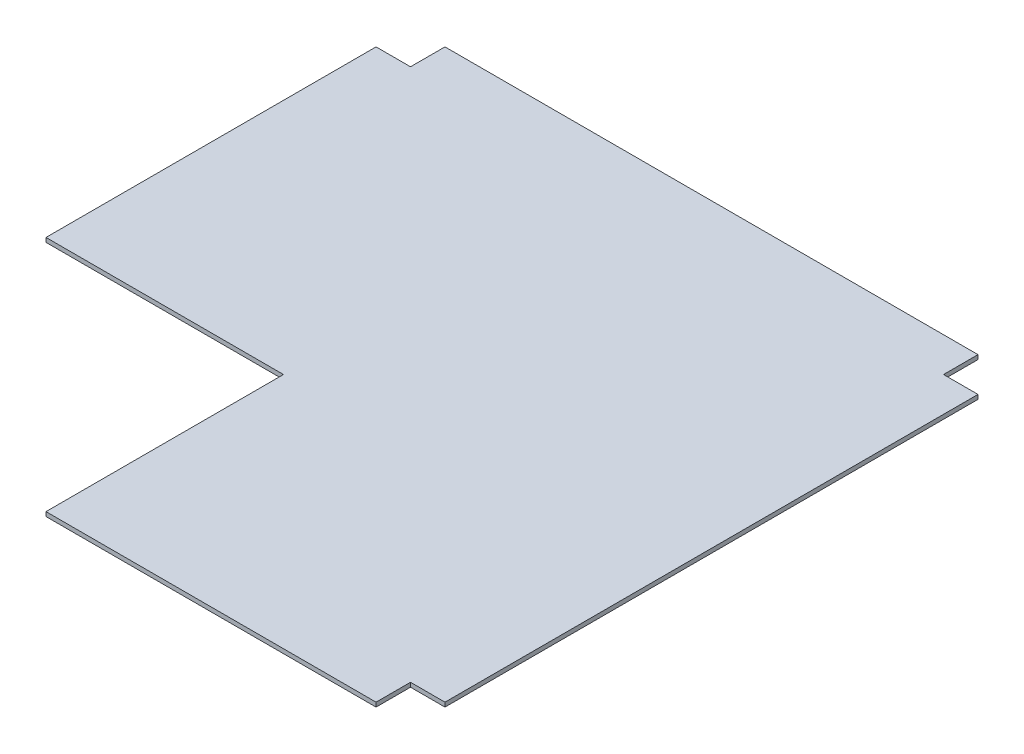
ISO-10303-21;
HEADER;
FILE_DESCRIPTION(('STEP AP214'),'2;1');
FILE_NAME('part.step','',(''),(''),'','','');
FILE_SCHEMA(('AUTOMOTIVE_DESIGN { 1 0 10303 214 1 1 1 1 }'));
ENDSEC;
DATA;
#1=APPLICATION_CONTEXT('core data for automotive mechanical design processes');
#2=APPLICATION_PROTOCOL_DEFINITION('international standard','automotive_design',2000,#1);
#3=PRODUCT_CONTEXT('',#1,'mechanical');
#4=PRODUCT('Part','Part','',(#3));
#5=PRODUCT_RELATED_PRODUCT_CATEGORY('part','',(#4));
#6=PRODUCT_DEFINITION_FORMATION('','',#4);
#7=PRODUCT_DEFINITION_CONTEXT('part definition',#1,'design');
#8=PRODUCT_DEFINITION('design','',#6,#7);
#9=PRODUCT_DEFINITION_SHAPE('','',#8);
#10=(LENGTH_UNIT() NAMED_UNIT(*) SI_UNIT(.MILLI.,.METRE.));
#11=(NAMED_UNIT(*) PLANE_ANGLE_UNIT() SI_UNIT($,.RADIAN.));
#12=(NAMED_UNIT(*) SI_UNIT($,.STERADIAN.) SOLID_ANGLE_UNIT());
#13=UNCERTAINTY_MEASURE_WITH_UNIT(LENGTH_MEASURE(1.E-05),#10,'distance_accuracy_value','');
#14=(GEOMETRIC_REPRESENTATION_CONTEXT(3) GLOBAL_UNCERTAINTY_ASSIGNED_CONTEXT((#13)) GLOBAL_UNIT_ASSIGNED_CONTEXT((#10,
#11,#12)) REPRESENTATION_CONTEXT('',''));
#15=CARTESIAN_POINT('',(0.,0.,0.));
#16=DIRECTION('',(0.,0.,1.));
#17=DIRECTION('',(1.,0.,0.));
#18=AXIS2_PLACEMENT_3D('',#15,#16,#17);
#19=CARTESIAN_POINT('',(175.,3.175,0.));
#20=DIRECTION('',(-1.,0.,0.));
#21=DIRECTION('',(0.,0.,1.));
#22=AXIS2_PLACEMENT_3D('',#19,#20,#21);
#23=PLANE('',#22);
#24=DIRECTION('',(0.,0.,-1.));
#25=VECTOR('',#24,1.);
#26=CARTESIAN_POINT('',(175.,0.,0.));
#27=LINE('',#26,#25);
#28=CARTESIAN_POINT('',(175.,0.,0.));
#29=VERTEX_POINT('',#28);
#30=CARTESIAN_POINT('',(175.,0.,-175.));
#31=VERTEX_POINT('',#30);
#32=EDGE_CURVE('E168',#29,#31,#27,.T.);
#33=ORIENTED_EDGE('',*,*,#32,.F.);
#34=DIRECTION('',(0.,-1.,0.));
#35=VECTOR('',#34,1.);
#36=CARTESIAN_POINT('',(175.,3.175,0.));
#37=LINE('',#36,#35);
#38=CARTESIAN_POINT('',(175.,3.175,0.));
#39=VERTEX_POINT('',#38);
#40=EDGE_CURVE('E11',#39,#29,#37,.T.);
#41=ORIENTED_EDGE('',*,*,#40,.F.);
#42=DIRECTION('',(0.,0.,-1.));
#43=VECTOR('',#42,1.);
#44=CARTESIAN_POINT('',(175.,3.175,0.));
#45=LINE('',#44,#43);
#46=CARTESIAN_POINT('',(175.,3.175,-175.));
#47=VERTEX_POINT('',#46);
#48=EDGE_CURVE('E210',#39,#47,#45,.T.);
#49=ORIENTED_EDGE('',*,*,#48,.T.);
#50=DIRECTION('',(0.,-1.,0.));
#51=VECTOR('',#50,1.);
#52=CARTESIAN_POINT('',(175.,3.175,-175.));
#53=LINE('',#52,#51);
#54=EDGE_CURVE('E108',#47,#31,#53,.T.);
#55=ORIENTED_EDGE('',*,*,#54,.T.);
#56=EDGE_LOOP('',(#33,#41,#49,#55));
#57=FACE_BOUND('',#56,.T.);
#58=ADVANCED_FACE('F45',(#57),#23,.T.);
#59=CARTESIAN_POINT('',(0.,3.175,0.));
#60=DIRECTION('',(0.,0.,-1.));
#61=DIRECTION('',(-1.,0.,0.));
#62=AXIS2_PLACEMENT_3D('',#59,#60,#61);
#63=PLANE('',#62);
#64=DIRECTION('',(1.,0.,0.));
#65=VECTOR('',#64,1.);
#66=CARTESIAN_POINT('',(0.,0.,0.));
#67=LINE('',#66,#65);
#68=CARTESIAN_POINT('',(418.25,0.,0.));
#69=VERTEX_POINT('',#68);
#70=EDGE_CURVE('E172',#29,#69,#67,.T.);
#71=ORIENTED_EDGE('',*,*,#70,.T.);
#72=DIRECTION('',(0.,-1.,0.));
#73=VECTOR('',#72,1.);
#74=CARTESIAN_POINT('',(418.25,3.175,0.));
#75=LINE('',#74,#73);
#76=CARTESIAN_POINT('',(418.25,3.175,0.));
#77=VERTEX_POINT('',#76);
#78=EDGE_CURVE('E54',#77,#69,#75,.T.);
#79=ORIENTED_EDGE('',*,*,#78,.F.);
#80=DIRECTION('',(1.,0.,0.));
#81=VECTOR('',#80,1.);
#82=CARTESIAN_POINT('',(0.,3.175,0.));
#83=LINE('',#82,#81);
#84=EDGE_CURVE('E264',#39,#77,#83,.T.);
#85=ORIENTED_EDGE('',*,*,#84,.F.);
#86=ORIENTED_EDGE('',*,*,#40,.T.);
#87=EDGE_LOOP('',(#71,#79,#85,#86));
#88=FACE_BOUND('',#87,.T.);
#89=ADVANCED_FACE('F299',(#88),#63,.F.);
#90=CARTESIAN_POINT('',(418.25,3.175,0.));
#91=DIRECTION('',(-1.,0.,0.));
#92=DIRECTION('',(0.,0.,1.));
#93=AXIS2_PLACEMENT_3D('',#90,#91,#92);
#94=PLANE('',#93);
#95=DIRECTION('',(0.,0.,-1.));
#96=VECTOR('',#95,1.);
#97=CARTESIAN_POINT('',(418.25,0.,0.));
#98=LINE('',#97,#96);
#99=CARTESIAN_POINT('',(418.25,0.,-25.4));
#100=VERTEX_POINT('',#99);
#101=EDGE_CURVE('E175',#69,#100,#98,.T.);
#102=ORIENTED_EDGE('',*,*,#101,.T.);
#103=DIRECTION('',(0.,-1.,0.));
#104=VECTOR('',#103,1.);
#105=CARTESIAN_POINT('',(418.25,3.175,-25.4));
#106=LINE('',#105,#104);
#107=CARTESIAN_POINT('',(418.25,3.175,-25.4));
#108=VERTEX_POINT('',#107);
#109=EDGE_CURVE('E233',#108,#100,#106,.T.);
#110=ORIENTED_EDGE('',*,*,#109,.F.);
#111=DIRECTION('',(0.,0.,-1.));
#112=VECTOR('',#111,1.);
#113=CARTESIAN_POINT('',(418.25,3.175,0.));
#114=LINE('',#113,#112);
#115=EDGE_CURVE('E243',#77,#108,#114,.T.);
#116=ORIENTED_EDGE('',*,*,#115,.F.);
#117=ORIENTED_EDGE('',*,*,#78,.T.);
#118=EDGE_LOOP('',(#102,#110,#116,#117));
#119=FACE_BOUND('',#118,.T.);
#120=ADVANCED_FACE('F241',(#119),#94,.F.);
#121=CARTESIAN_POINT('',(0.,3.175,-25.4));
#122=DIRECTION('',(0.,0.,1.));
#123=DIRECTION('',(1.,0.,0.));
#124=AXIS2_PLACEMENT_3D('',#121,#122,#123);
#125=PLANE('',#124);
#126=DIRECTION('',(-1.,0.,0.));
#127=VECTOR('',#126,1.);
#128=CARTESIAN_POINT('',(0.,0.,-25.4));
#129=LINE('',#128,#127);
#130=CARTESIAN_POINT('',(443.65,0.,-25.4));
#131=VERTEX_POINT('',#130);
#132=EDGE_CURVE('E179',#131,#100,#129,.T.);
#133=ORIENTED_EDGE('',*,*,#132,.F.);
#134=DIRECTION('',(0.,-1.,0.));
#135=VECTOR('',#134,1.);
#136=CARTESIAN_POINT('',(443.65,3.175,-25.4));
#137=LINE('',#136,#135);
#138=CARTESIAN_POINT('',(443.65,3.175,-25.4));
#139=VERTEX_POINT('',#138);
#140=EDGE_CURVE('E230',#139,#131,#137,.T.);
#141=ORIENTED_EDGE('',*,*,#140,.F.);
#142=DIRECTION('',(-1.,0.,0.));
#143=VECTOR('',#142,1.);
#144=CARTESIAN_POINT('',(0.,3.175,-25.4));
#145=LINE('',#144,#143);
#146=EDGE_CURVE('E256',#139,#108,#145,.T.);
#147=ORIENTED_EDGE('',*,*,#146,.T.);
#148=ORIENTED_EDGE('',*,*,#109,.T.);
#149=EDGE_LOOP('',(#133,#141,#147,#148));
#150=FACE_BOUND('',#149,.T.);
#151=ADVANCED_FACE('F252',(#150),#125,.T.);
#152=CARTESIAN_POINT('',(443.65,3.175,0.));
#153=DIRECTION('',(-1.,0.,0.));
#154=DIRECTION('',(0.,0.,1.));
#155=AXIS2_PLACEMENT_3D('',#152,#153,#154);
#156=PLANE('',#155);
#157=DIRECTION('',(0.,0.,-1.));
#158=VECTOR('',#157,1.);
#159=CARTESIAN_POINT('',(443.65,0.,0.));
#160=LINE('',#159,#158);
#161=CARTESIAN_POINT('',(443.65,0.,-418.25));
#162=VERTEX_POINT('',#161);
#163=EDGE_CURVE('E183',#131,#162,#160,.T.);
#164=ORIENTED_EDGE('',*,*,#163,.T.);
#165=DIRECTION('',(0.,-1.,0.));
#166=VECTOR('',#165,1.);
#167=CARTESIAN_POINT('',(443.65,3.175,-418.25));
#168=LINE('',#167,#166);
#169=CARTESIAN_POINT('',(443.65,3.175,-418.25));
#170=VERTEX_POINT('',#169);
#171=EDGE_CURVE('E226',#170,#162,#168,.T.);
#172=ORIENTED_EDGE('',*,*,#171,.F.);
#173=DIRECTION('',(0.,0.,-1.));
#174=VECTOR('',#173,1.);
#175=CARTESIAN_POINT('',(443.65,3.175,0.));
#176=LINE('',#175,#174);
#177=EDGE_CURVE('E258',#139,#170,#176,.T.);
#178=ORIENTED_EDGE('',*,*,#177,.F.);
#179=ORIENTED_EDGE('',*,*,#140,.T.);
#180=EDGE_LOOP('',(#164,#172,#178,#179));
#181=FACE_BOUND('',#180,.T.);
#182=ADVANCED_FACE('F374',(#181),#156,.F.);
#183=CARTESIAN_POINT('',(9.14076338680065E-13,3.175,-418.250000000001));
#184=DIRECTION('',(0.,0.,1.));
#185=DIRECTION('',(1.,0.,0.));
#186=AXIS2_PLACEMENT_3D('',#183,#184,#185);
#187=PLANE('',#186);
#188=DIRECTION('',(-1.,0.,0.));
#189=VECTOR('',#188,1.);
#190=CARTESIAN_POINT('',(9.14076338680065E-13,0.,-418.250000000001));
#191=LINE('',#190,#189);
#192=CARTESIAN_POINT('',(418.25,0.,-418.25));
#193=VERTEX_POINT('',#192);
#194=EDGE_CURVE('E186',#162,#193,#191,.T.);
#195=ORIENTED_EDGE('',*,*,#194,.T.);
#196=DIRECTION('',(0.,-1.,0.));
#197=VECTOR('',#196,1.);
#198=CARTESIAN_POINT('',(418.25,3.175,-418.25));
#199=LINE('',#198,#197);
#200=CARTESIAN_POINT('',(418.25,3.175,-418.25));
#201=VERTEX_POINT('',#200);
#202=EDGE_CURVE('E223',#201,#193,#199,.T.);
#203=ORIENTED_EDGE('',*,*,#202,.F.);
#204=DIRECTION('',(-1.,0.,0.));
#205=VECTOR('',#204,1.);
#206=CARTESIAN_POINT('',(9.14076338680065E-13,3.175,-418.250000000001));
#207=LINE('',#206,#205);
#208=EDGE_CURVE('E262',#170,#201,#207,.T.);
#209=ORIENTED_EDGE('',*,*,#208,.F.);
#210=ORIENTED_EDGE('',*,*,#171,.T.);
#211=EDGE_LOOP('',(#195,#203,#209,#210));
#212=FACE_BOUND('',#211,.T.);
#213=ADVANCED_FACE('F364',(#212),#187,.F.);
#214=CARTESIAN_POINT('',(418.25,3.175,0.));
#215=DIRECTION('',(1.,0.,0.));
#216=DIRECTION('',(0.,0.,-1.));
#217=AXIS2_PLACEMENT_3D('',#214,#215,#216);
#218=PLANE('',#217);
#219=DIRECTION('',(0.,0.,1.));
#220=VECTOR('',#219,1.);
#221=CARTESIAN_POINT('',(418.25,0.,0.));
#222=LINE('',#221,#220);
#223=CARTESIAN_POINT('',(418.25,0.,-443.65));
#224=VERTEX_POINT('',#223);
#225=EDGE_CURVE('E190',#224,#193,#222,.T.);
#226=ORIENTED_EDGE('',*,*,#225,.F.);
#227=DIRECTION('',(0.,-1.,0.));
#228=VECTOR('',#227,1.);
#229=CARTESIAN_POINT('',(418.25,3.175,-443.65));
#230=LINE('',#229,#228);
#231=CARTESIAN_POINT('',(418.25,3.175,-443.65));
#232=VERTEX_POINT('',#231);
#233=EDGE_CURVE('E220',#232,#224,#230,.T.);
#234=ORIENTED_EDGE('',*,*,#233,.F.);
#235=DIRECTION('',(0.,0.,1.));
#236=VECTOR('',#235,1.);
#237=CARTESIAN_POINT('',(418.25,3.175,0.));
#238=LINE('',#237,#236);
#239=EDGE_CURVE('E270',#232,#201,#238,.T.);
#240=ORIENTED_EDGE('',*,*,#239,.T.);
#241=ORIENTED_EDGE('',*,*,#202,.T.);
#242=EDGE_LOOP('',(#226,#234,#240,#241));
#243=FACE_BOUND('',#242,.T.);
#244=ADVANCED_FACE('F286',(#243),#218,.T.);
#245=CARTESIAN_POINT('',(0.,3.175,-443.65));
#246=DIRECTION('',(0.,0.,-1.));
#247=DIRECTION('',(-1.,0.,0.));
#248=AXIS2_PLACEMENT_3D('',#245,#246,#247);
#249=PLANE('',#248);
#250=DIRECTION('',(1.,0.,0.));
#251=VECTOR('',#250,1.);
#252=CARTESIAN_POINT('',(0.,0.,-443.65));
#253=LINE('',#252,#251);
#254=CARTESIAN_POINT('',(25.4,0.,-443.65));
#255=VERTEX_POINT('',#254);
#256=EDGE_CURVE('E194',#255,#224,#253,.T.);
#257=ORIENTED_EDGE('',*,*,#256,.F.);
#258=DIRECTION('',(0.,-1.,0.));
#259=VECTOR('',#258,1.);
#260=CARTESIAN_POINT('',(25.4,3.175,-443.65));
#261=LINE('',#260,#259);
#262=CARTESIAN_POINT('',(25.4,3.175,-443.65));
#263=VERTEX_POINT('',#262);
#264=EDGE_CURVE('E217',#263,#255,#261,.T.);
#265=ORIENTED_EDGE('',*,*,#264,.F.);
#266=DIRECTION('',(1.,0.,0.));
#267=VECTOR('',#266,1.);
#268=CARTESIAN_POINT('',(0.,3.175,-443.65));
#269=LINE('',#268,#267);
#270=EDGE_CURVE('E274',#263,#232,#269,.T.);
#271=ORIENTED_EDGE('',*,*,#270,.T.);
#272=ORIENTED_EDGE('',*,*,#233,.T.);
#273=EDGE_LOOP('',(#257,#265,#271,#272));
#274=FACE_BOUND('',#273,.T.);
#275=ADVANCED_FACE('F280',(#274),#249,.T.);
#276=CARTESIAN_POINT('',(25.4000000000001,3.175,0.));
#277=DIRECTION('',(1.,0.,0.));
#278=DIRECTION('',(0.,0.,-1.));
#279=AXIS2_PLACEMENT_3D('',#276,#277,#278);
#280=PLANE('',#279);
#281=DIRECTION('',(0.,0.,1.));
#282=VECTOR('',#281,1.);
#283=CARTESIAN_POINT('',(25.4000000000001,0.,0.));
#284=LINE('',#283,#282);
#285=CARTESIAN_POINT('',(25.4,0.,-418.25));
#286=VERTEX_POINT('',#285);
#287=EDGE_CURVE('E198',#255,#286,#284,.T.);
#288=ORIENTED_EDGE('',*,*,#287,.T.);
#289=DIRECTION('',(0.,-1.,0.));
#290=VECTOR('',#289,1.);
#291=CARTESIAN_POINT('',(25.4,3.175,-418.25));
#292=LINE('',#291,#290);
#293=CARTESIAN_POINT('',(25.4,3.175,-418.25));
#294=VERTEX_POINT('',#293);
#295=EDGE_CURVE('E151',#294,#286,#292,.T.);
#296=ORIENTED_EDGE('',*,*,#295,.F.);
#297=DIRECTION('',(0.,0.,1.));
#298=VECTOR('',#297,1.);
#299=CARTESIAN_POINT('',(25.4000000000001,3.175,0.));
#300=LINE('',#299,#298);
#301=EDGE_CURVE('E157',#263,#294,#300,.T.);
#302=ORIENTED_EDGE('',*,*,#301,.F.);
#303=ORIENTED_EDGE('',*,*,#264,.T.);
#304=EDGE_LOOP('',(#288,#296,#302,#303));
#305=FACE_BOUND('',#304,.T.);
#306=ADVANCED_FACE('F289',(#305),#280,.F.);
#307=CARTESIAN_POINT('',(0.,3.175,-418.25));
#308=DIRECTION('',(0.,0.,-1.));
#309=DIRECTION('',(-1.,0.,0.));
#310=AXIS2_PLACEMENT_3D('',#307,#308,#309);
#311=PLANE('',#310);
#312=DIRECTION('',(1.,0.,0.));
#313=VECTOR('',#312,1.);
#314=CARTESIAN_POINT('',(0.,0.,-418.25));
#315=LINE('',#314,#313);
#316=CARTESIAN_POINT('',(0.,0.,-418.25));
#317=VERTEX_POINT('',#316);
#318=EDGE_CURVE('E145',#317,#286,#315,.T.);
#319=ORIENTED_EDGE('',*,*,#318,.F.);
#320=DIRECTION('',(0.,-1.,0.));
#321=VECTOR('',#320,1.);
#322=CARTESIAN_POINT('',(0.,3.175,-418.25));
#323=LINE('',#322,#321);
#324=CARTESIAN_POINT('',(0.,3.175,-418.25));
#325=VERTEX_POINT('',#324);
#326=EDGE_CURVE('E140',#325,#317,#323,.T.);
#327=ORIENTED_EDGE('',*,*,#326,.F.);
#328=DIRECTION('',(1.,0.,0.));
#329=VECTOR('',#328,1.);
#330=CARTESIAN_POINT('',(0.,3.175,-418.25));
#331=LINE('',#330,#329);
#332=EDGE_CURVE('E143',#325,#294,#331,.T.);
#333=ORIENTED_EDGE('',*,*,#332,.T.);
#334=ORIENTED_EDGE('',*,*,#295,.T.);
#335=EDGE_LOOP('',(#319,#327,#333,#334));
#336=FACE_BOUND('',#335,.T.);
#337=ADVANCED_FACE('F142',(#336),#311,.T.);
#338=CARTESIAN_POINT('',(0.,3.175,0.));
#339=DIRECTION('',(-1.,0.,0.));
#340=DIRECTION('',(0.,0.,1.));
#341=AXIS2_PLACEMENT_3D('',#338,#339,#340);
#342=PLANE('',#341);
#343=DIRECTION('',(0.,0.,-1.));
#344=VECTOR('',#343,1.);
#345=CARTESIAN_POINT('',(0.,0.,0.));
#346=LINE('',#345,#344);
#347=CARTESIAN_POINT('',(0.,0.,-175.));
#348=VERTEX_POINT('',#347);
#349=EDGE_CURVE('E204',#348,#317,#346,.T.);
#350=ORIENTED_EDGE('',*,*,#349,.F.);
#351=DIRECTION('',(0.,-1.,0.));
#352=VECTOR('',#351,1.);
#353=CARTESIAN_POINT('',(0.,3.175,-175.));
#354=LINE('',#353,#352);
#355=CARTESIAN_POINT('',(0.,3.175,-175.));
#356=VERTEX_POINT('',#355);
#357=EDGE_CURVE('E101',#356,#348,#354,.T.);
#358=ORIENTED_EDGE('',*,*,#357,.F.);
#359=DIRECTION('',(0.,0.,-1.));
#360=VECTOR('',#359,1.);
#361=CARTESIAN_POINT('',(0.,3.175,0.));
#362=LINE('',#361,#360);
#363=EDGE_CURVE('E154',#356,#325,#362,.T.);
#364=ORIENTED_EDGE('',*,*,#363,.T.);
#365=ORIENTED_EDGE('',*,*,#326,.T.);
#366=EDGE_LOOP('',(#350,#358,#364,#365));
#367=FACE_BOUND('',#366,.T.);
#368=ADVANCED_FACE('F161',(#367),#342,.T.);
#369=CARTESIAN_POINT('',(0.,3.175,-175.));
#370=DIRECTION('',(0.,0.,-1.));
#371=DIRECTION('',(-1.,0.,0.));
#372=AXIS2_PLACEMENT_3D('',#369,#370,#371);
#373=PLANE('',#372);
#374=DIRECTION('',(1.,0.,0.));
#375=VECTOR('',#374,1.);
#376=CARTESIAN_POINT('',(0.,0.,-175.));
#377=LINE('',#376,#375);
#378=EDGE_CURVE('E207',#348,#31,#377,.T.);
#379=ORIENTED_EDGE('',*,*,#378,.T.);
#380=ORIENTED_EDGE('',*,*,#54,.F.);
#381=DIRECTION('',(1.,0.,0.));
#382=VECTOR('',#381,1.);
#383=CARTESIAN_POINT('',(0.,3.175,-175.));
#384=LINE('',#383,#382);
#385=EDGE_CURVE('E62',#356,#47,#384,.T.);
#386=ORIENTED_EDGE('',*,*,#385,.F.);
#387=ORIENTED_EDGE('',*,*,#357,.T.);
#388=EDGE_LOOP('',(#379,#380,#386,#387));
#389=FACE_BOUND('',#388,.T.);
#390=ADVANCED_FACE('F303',(#389),#373,.F.);
#391=CARTESIAN_POINT('',(0.,3.175,0.));
#392=DIRECTION('',(0.,1.,0.));
#393=DIRECTION('',(0.,0.,1.));
#394=AXIS2_PLACEMENT_3D('',#391,#392,#393);
#395=PLANE('',#394);
#396=ORIENTED_EDGE('',*,*,#48,.F.);
#397=ORIENTED_EDGE('',*,*,#84,.T.);
#398=ORIENTED_EDGE('',*,*,#115,.T.);
#399=ORIENTED_EDGE('',*,*,#146,.F.);
#400=ORIENTED_EDGE('',*,*,#177,.T.);
#401=ORIENTED_EDGE('',*,*,#208,.T.);
#402=ORIENTED_EDGE('',*,*,#239,.F.);
#403=ORIENTED_EDGE('',*,*,#270,.F.);
#404=ORIENTED_EDGE('',*,*,#301,.T.);
#405=ORIENTED_EDGE('',*,*,#332,.F.);
#406=ORIENTED_EDGE('',*,*,#363,.F.);
#407=ORIENTED_EDGE('',*,*,#385,.T.);
#408=EDGE_LOOP('',(#396,#397,#398,#399,#400,#401,#402,#403,#404,#405,#406,#407));
#409=FACE_BOUND('',#408,.T.);
#410=ADVANCED_FACE('F153',(#409),#395,.T.);
#411=CARTESIAN_POINT('',(0.,0.,0.));
#412=DIRECTION('',(0.,1.,0.));
#413=DIRECTION('',(0.,0.,1.));
#414=AXIS2_PLACEMENT_3D('',#411,#412,#413);
#415=PLANE('',#414);
#416=ORIENTED_EDGE('',*,*,#32,.T.);
#417=ORIENTED_EDGE('',*,*,#378,.F.);
#418=ORIENTED_EDGE('',*,*,#349,.T.);
#419=ORIENTED_EDGE('',*,*,#318,.T.);
#420=ORIENTED_EDGE('',*,*,#287,.F.);
#421=ORIENTED_EDGE('',*,*,#256,.T.);
#422=ORIENTED_EDGE('',*,*,#225,.T.);
#423=ORIENTED_EDGE('',*,*,#194,.F.);
#424=ORIENTED_EDGE('',*,*,#163,.F.);
#425=ORIENTED_EDGE('',*,*,#132,.T.);
#426=ORIENTED_EDGE('',*,*,#101,.F.);
#427=ORIENTED_EDGE('',*,*,#70,.F.);
#428=EDGE_LOOP('',(#416,#417,#418,#419,#420,#421,#422,#423,#424,#425,#426,#427));
#429=FACE_BOUND('',#428,.T.);
#430=ADVANCED_FACE('F247',(#429),#415,.F.);
#431=CLOSED_SHELL('',(#58,#89,#120,#151,#182,#213,#244,#275,#306,#337,#368,#390,#410,#430));
#432=MANIFOLD_SOLID_BREP('B2',#431);
#433=ADVANCED_BREP_SHAPE_REPRESENTATION('',(#18,#432),#14);
#434=SHAPE_DEFINITION_REPRESENTATION(#9,#433);
ENDSEC;
END-ISO-10303-21;
